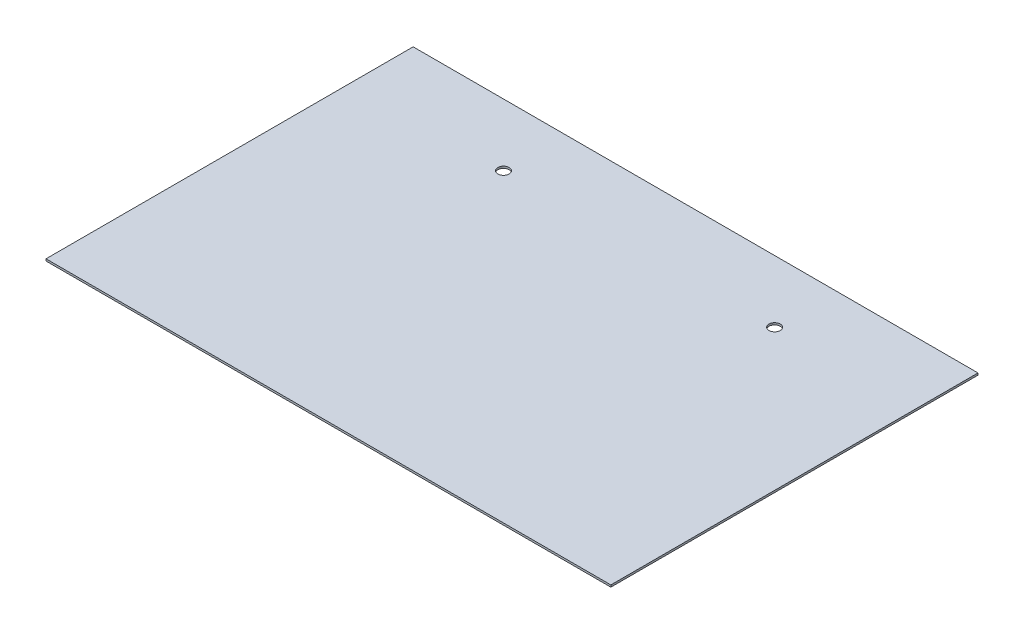
ISO-10303-21;
HEADER;
FILE_DESCRIPTION(('STEP AP214'),'2;1');
FILE_NAME('part.step','',(''),(''),'','','');
FILE_SCHEMA(('AUTOMOTIVE_DESIGN { 1 0 10303 214 1 1 1 1 }'));
ENDSEC;
DATA;
#1=APPLICATION_CONTEXT('core data for automotive mechanical design processes');
#2=APPLICATION_PROTOCOL_DEFINITION('international standard','automotive_design',2000,#1);
#3=PRODUCT_CONTEXT('',#1,'mechanical');
#4=PRODUCT('Part','Part','',(#3));
#5=PRODUCT_RELATED_PRODUCT_CATEGORY('part','',(#4));
#6=PRODUCT_DEFINITION_FORMATION('','',#4);
#7=PRODUCT_DEFINITION_CONTEXT('part definition',#1,'design');
#8=PRODUCT_DEFINITION('design','',#6,#7);
#9=PRODUCT_DEFINITION_SHAPE('','',#8);
#10=(LENGTH_UNIT() NAMED_UNIT(*) SI_UNIT(.MILLI.,.METRE.));
#11=(NAMED_UNIT(*) PLANE_ANGLE_UNIT() SI_UNIT($,.RADIAN.));
#12=(NAMED_UNIT(*) SI_UNIT($,.STERADIAN.) SOLID_ANGLE_UNIT());
#13=UNCERTAINTY_MEASURE_WITH_UNIT(LENGTH_MEASURE(1.E-05),#10,'distance_accuracy_value','');
#14=(GEOMETRIC_REPRESENTATION_CONTEXT(3) GLOBAL_UNCERTAINTY_ASSIGNED_CONTEXT((#13)) GLOBAL_UNIT_ASSIGNED_CONTEXT((#10,
#11,#12)) REPRESENTATION_CONTEXT('',''));
#15=CARTESIAN_POINT('',(0.,0.,0.));
#16=DIRECTION('',(0.,0.,1.));
#17=DIRECTION('',(1.,0.,0.));
#18=AXIS2_PLACEMENT_3D('',#15,#16,#17);
#19=CARTESIAN_POINT('',(65.,-1.41,67.5));
#20=DIRECTION('',(1.,0.,0.));
#21=DIRECTION('',(0.,0.,-1.));
#22=AXIS2_PLACEMENT_3D('',#19,#20,#21);
#23=PLANE('',#22);
#24=DIRECTION('',(0.,1.,0.));
#25=VECTOR('',#24,1.);
#26=CARTESIAN_POINT('',(65.,-1.41,-62.5));
#27=LINE('',#26,#25);
#28=CARTESIAN_POINT('',(65.,-1.4,-62.5));
#29=VERTEX_POINT('',#28);
#30=CARTESIAN_POINT('',(65.,-0.7,-62.5));
#31=VERTEX_POINT('',#30);
#32=EDGE_CURVE('E47',#29,#31,#27,.T.);
#33=ORIENTED_EDGE('',*,*,#32,.T.);
#34=DIRECTION('',(0.,0.,1.));
#35=VECTOR('',#34,1.);
#36=CARTESIAN_POINT('',(65.,-0.7,0.));
#37=LINE('',#36,#35);
#38=CARTESIAN_POINT('',(65.,-0.7,67.5));
#39=VERTEX_POINT('',#38);
#40=EDGE_CURVE('E121',#31,#39,#37,.T.);
#41=ORIENTED_EDGE('',*,*,#40,.T.);
#42=DIRECTION('',(0.,1.,0.));
#43=VECTOR('',#42,1.);
#44=CARTESIAN_POINT('',(65.,-1.41,67.5));
#45=LINE('',#44,#43);
#46=CARTESIAN_POINT('',(65.,-1.4,67.5));
#47=VERTEX_POINT('',#46);
#48=EDGE_CURVE('E55',#47,#39,#45,.T.);
#49=ORIENTED_EDGE('',*,*,#48,.F.);
#50=DIRECTION('',(0.,0.,1.));
#51=VECTOR('',#50,1.);
#52=CARTESIAN_POINT('',(65.,-1.4,0.));
#53=LINE('',#52,#51);
#54=EDGE_CURVE('E84',#29,#47,#53,.T.);
#55=ORIENTED_EDGE('',*,*,#54,.F.);
#56=EDGE_LOOP('',(#33,#41,#49,#55));
#57=FACE_BOUND('',#56,.T.);
#58=ADVANCED_FACE('F38',(#57),#23,.T.);
#59=CARTESIAN_POINT('',(-135.,-1.41,67.5));
#60=DIRECTION('',(-1.,0.,0.));
#61=DIRECTION('',(0.,0.,1.));
#62=AXIS2_PLACEMENT_3D('',#59,#60,#61);
#63=PLANE('',#62);
#64=DIRECTION('',(0.,1.,0.));
#65=VECTOR('',#64,1.);
#66=CARTESIAN_POINT('',(-135.,-1.41,67.5));
#67=LINE('',#66,#65);
#68=CARTESIAN_POINT('',(-135.,-1.4,67.5));
#69=VERTEX_POINT('',#68);
#70=CARTESIAN_POINT('',(-135.,-0.7,67.5));
#71=VERTEX_POINT('',#70);
#72=EDGE_CURVE('E92',#69,#71,#67,.T.);
#73=ORIENTED_EDGE('',*,*,#72,.T.);
#74=DIRECTION('',(0.,0.,-1.));
#75=VECTOR('',#74,1.);
#76=CARTESIAN_POINT('',(-135.,-0.7,0.));
#77=LINE('',#76,#75);
#78=CARTESIAN_POINT('',(-135.,-0.7,-62.5));
#79=VERTEX_POINT('',#78);
#80=EDGE_CURVE('E97',#71,#79,#77,.T.);
#81=ORIENTED_EDGE('',*,*,#80,.T.);
#82=DIRECTION('',(0.,1.,0.));
#83=VECTOR('',#82,1.);
#84=CARTESIAN_POINT('',(-135.,-1.41,-62.5));
#85=LINE('',#84,#83);
#86=CARTESIAN_POINT('',(-135.,-1.4,-62.5));
#87=VERTEX_POINT('',#86);
#88=EDGE_CURVE('E11',#87,#79,#85,.T.);
#89=ORIENTED_EDGE('',*,*,#88,.F.);
#90=DIRECTION('',(0.,0.,-1.));
#91=VECTOR('',#90,1.);
#92=CARTESIAN_POINT('',(-135.,-1.4,0.));
#93=LINE('',#92,#91);
#94=EDGE_CURVE('E82',#69,#87,#93,.T.);
#95=ORIENTED_EDGE('',*,*,#94,.F.);
#96=EDGE_LOOP('',(#73,#81,#89,#95));
#97=FACE_BOUND('',#96,.T.);
#98=ADVANCED_FACE('F90',(#97),#63,.T.);
#99=CARTESIAN_POINT('',(65.,-1.41,-62.5));
#100=DIRECTION('',(0.,0.,-1.));
#101=DIRECTION('',(-1.,0.,0.));
#102=AXIS2_PLACEMENT_3D('',#99,#100,#101);
#103=PLANE('',#102);
#104=ORIENTED_EDGE('',*,*,#88,.T.);
#105=DIRECTION('',(1.,0.,0.));
#106=VECTOR('',#105,1.);
#107=CARTESIAN_POINT('',(0.,-0.7,-62.5));
#108=LINE('',#107,#106);
#109=EDGE_CURVE('E99',#79,#31,#108,.T.);
#110=ORIENTED_EDGE('',*,*,#109,.T.);
#111=ORIENTED_EDGE('',*,*,#32,.F.);
#112=DIRECTION('',(1.,0.,0.));
#113=VECTOR('',#112,1.);
#114=CARTESIAN_POINT('',(0.,-1.4,-62.5));
#115=LINE('',#114,#113);
#116=EDGE_CURVE('E93',#87,#29,#115,.T.);
#117=ORIENTED_EDGE('',*,*,#116,.F.);
#118=EDGE_LOOP('',(#104,#110,#111,#117));
#119=FACE_BOUND('',#118,.T.);
#120=ADVANCED_FACE('F126',(#119),#103,.T.);
#121=CARTESIAN_POINT('',(-150.,-0.7,67.5));
#122=DIRECTION('',(0.,0.,1.));
#123=DIRECTION('',(1.,0.,0.));
#124=AXIS2_PLACEMENT_3D('',#121,#122,#123);
#125=PLANE('',#124);
#126=DIRECTION('',(1.,0.,0.));
#127=VECTOR('',#126,1.);
#128=CARTESIAN_POINT('',(-150.,-1.4,67.5));
#129=LINE('',#128,#127);
#130=EDGE_CURVE('E78',#69,#47,#129,.T.);
#131=ORIENTED_EDGE('',*,*,#130,.T.);
#132=ORIENTED_EDGE('',*,*,#48,.T.);
#133=DIRECTION('',(1.,0.,0.));
#134=VECTOR('',#133,1.);
#135=CARTESIAN_POINT('',(-150.,-0.7,67.5));
#136=LINE('',#135,#134);
#137=EDGE_CURVE('E86',#71,#39,#136,.T.);
#138=ORIENTED_EDGE('',*,*,#137,.F.);
#139=ORIENTED_EDGE('',*,*,#72,.F.);
#140=EDGE_LOOP('',(#131,#132,#138,#139));
#141=FACE_BOUND('',#140,.T.);
#142=ADVANCED_FACE('F40',(#141),#125,.T.);
#143=CARTESIAN_POINT('',(0.,-0.7,0.));
#144=DIRECTION('',(0.,-1.,0.));
#145=DIRECTION('',(0.,0.,1.));
#146=AXIS2_PLACEMENT_3D('',#143,#144,#145);
#147=PLANE('',#146);
#148=CARTESIAN_POINT('',(15.,-0.7,-40.5));
#149=DIRECTION('',(0.,1.,0.));
#150=DIRECTION('',(0.,0.,1.));
#151=AXIS2_PLACEMENT_3D('',#148,#149,#150);
#152=CIRCLE('',#151,2.);
#153=CARTESIAN_POINT('',(15.,-0.7,-38.5));
#154=VERTEX_POINT('',#153);
#155=EDGE_CURVE('E106',#154,#154,#152,.T.);
#156=ORIENTED_EDGE('',*,*,#155,.F.);
#157=EDGE_LOOP('',(#156));
#158=FACE_BOUND('',#157,.T.);
#159=CARTESIAN_POINT('',(-81.,-0.7,-40.5));
#160=DIRECTION('',(0.,1.,0.));
#161=DIRECTION('',(0.,0.,1.));
#162=AXIS2_PLACEMENT_3D('',#159,#160,#161);
#163=CIRCLE('',#162,2.);
#164=CARTESIAN_POINT('',(-81.,-0.7,-38.5));
#165=VERTEX_POINT('',#164);
#166=EDGE_CURVE('E110',#165,#165,#163,.T.);
#167=ORIENTED_EDGE('',*,*,#166,.F.);
#168=EDGE_LOOP('',(#167));
#169=FACE_BOUND('',#168,.T.);
#170=ORIENTED_EDGE('',*,*,#40,.F.);
#171=ORIENTED_EDGE('',*,*,#109,.F.);
#172=ORIENTED_EDGE('',*,*,#80,.F.);
#173=ORIENTED_EDGE('',*,*,#137,.T.);
#174=EDGE_LOOP('',(#170,#171,#172,#173));
#175=FACE_BOUND('',#174,.T.);
#176=ADVANCED_FACE('F128',(#158,#169,#175),#147,.F.);
#177=CARTESIAN_POINT('',(0.,-1.4,0.));
#178=DIRECTION('',(0.,-1.,0.));
#179=DIRECTION('',(0.,0.,1.));
#180=AXIS2_PLACEMENT_3D('',#177,#178,#179);
#181=PLANE('',#180);
#182=CARTESIAN_POINT('',(15.,-1.4,-40.5));
#183=DIRECTION('',(0.,-1.,0.));
#184=DIRECTION('',(0.,0.,-1.));
#185=AXIS2_PLACEMENT_3D('',#182,#183,#184);
#186=CIRCLE('',#185,2.);
#187=CARTESIAN_POINT('',(15.,-1.4,-42.5));
#188=VERTEX_POINT('',#187);
#189=EDGE_CURVE('E42',#188,#188,#186,.T.);
#190=ORIENTED_EDGE('',*,*,#189,.F.);
#191=EDGE_LOOP('',(#190));
#192=FACE_BOUND('',#191,.T.);
#193=CARTESIAN_POINT('',(-81.,-1.4,-40.5));
#194=DIRECTION('',(0.,-1.,0.));
#195=DIRECTION('',(0.,0.,-1.));
#196=AXIS2_PLACEMENT_3D('',#193,#194,#195);
#197=CIRCLE('',#196,2.);
#198=CARTESIAN_POINT('',(-81.,-1.4,-42.5));
#199=VERTEX_POINT('',#198);
#200=EDGE_CURVE('E102',#199,#199,#197,.T.);
#201=ORIENTED_EDGE('',*,*,#200,.F.);
#202=EDGE_LOOP('',(#201));
#203=FACE_BOUND('',#202,.T.);
#204=ORIENTED_EDGE('',*,*,#116,.T.);
#205=ORIENTED_EDGE('',*,*,#54,.T.);
#206=ORIENTED_EDGE('',*,*,#130,.F.);
#207=ORIENTED_EDGE('',*,*,#94,.T.);
#208=EDGE_LOOP('',(#204,#205,#206,#207));
#209=FACE_BOUND('',#208,.T.);
#210=ADVANCED_FACE('F81',(#192,#203,#209),#181,.T.);
#211=CARTESIAN_POINT('',(-81.,-10.7,-40.5));
#212=DIRECTION('',(0.,1.,0.));
#213=DIRECTION('',(0.,0.,1.));
#214=AXIS2_PLACEMENT_3D('',#211,#212,#213);
#215=CYLINDRICAL_SURFACE('',#214,2.);
#216=ORIENTED_EDGE('',*,*,#200,.T.);
#217=EDGE_LOOP('',(#216));
#218=FACE_BOUND('',#217,.T.);
#219=ORIENTED_EDGE('',*,*,#166,.T.);
#220=EDGE_LOOP('',(#219));
#221=FACE_BOUND('',#220,.T.);
#222=ADVANCED_FACE('F135',(#218,#221),#215,.F.);
#223=CARTESIAN_POINT('',(15.,-10.7,-40.5));
#224=DIRECTION('',(0.,1.,0.));
#225=DIRECTION('',(0.,0.,1.));
#226=AXIS2_PLACEMENT_3D('',#223,#224,#225);
#227=CYLINDRICAL_SURFACE('',#226,2.);
#228=ORIENTED_EDGE('',*,*,#189,.T.);
#229=EDGE_LOOP('',(#228));
#230=FACE_BOUND('',#229,.T.);
#231=ORIENTED_EDGE('',*,*,#155,.T.);
#232=EDGE_LOOP('',(#231));
#233=FACE_BOUND('',#232,.T.);
#234=ADVANCED_FACE('F152',(#230,#233),#227,.F.);
#235=CLOSED_SHELL('',(#58,#98,#120,#142,#176,#210,#222,#234));
#236=MANIFOLD_SOLID_BREP('B2',#235);
#237=ADVANCED_BREP_SHAPE_REPRESENTATION('',(#18,#236),#14);
#238=SHAPE_DEFINITION_REPRESENTATION(#9,#237);
ENDSEC;
END-ISO-10303-21;
